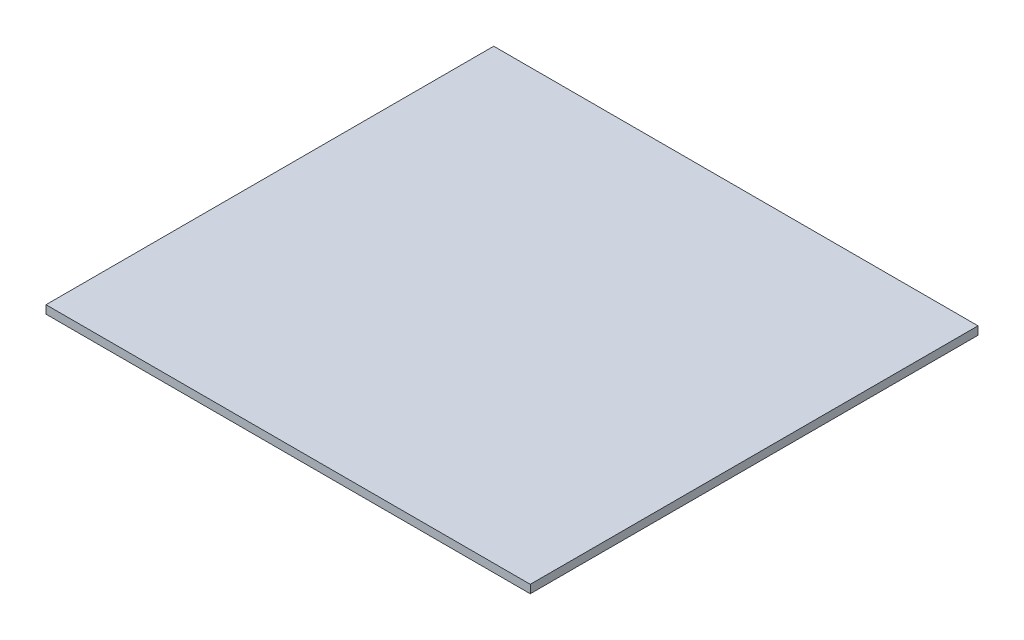
ISO-10303-21;
HEADER;
FILE_DESCRIPTION(('STEP AP214'),'2;1');
FILE_NAME('part.step','',(''),(''),'','','');
FILE_SCHEMA(('AUTOMOTIVE_DESIGN { 1 0 10303 214 1 1 1 1 }'));
ENDSEC;
DATA;
#1=APPLICATION_CONTEXT('core data for automotive mechanical design processes');
#2=APPLICATION_PROTOCOL_DEFINITION('international standard','automotive_design',2000,#1);
#3=PRODUCT_CONTEXT('',#1,'mechanical');
#4=PRODUCT('Part','Part','',(#3));
#5=PRODUCT_RELATED_PRODUCT_CATEGORY('part','',(#4));
#6=PRODUCT_DEFINITION_FORMATION('','',#4);
#7=PRODUCT_DEFINITION_CONTEXT('part definition',#1,'design');
#8=PRODUCT_DEFINITION('design','',#6,#7);
#9=PRODUCT_DEFINITION_SHAPE('','',#8);
#10=(LENGTH_UNIT() NAMED_UNIT(*) SI_UNIT(.MILLI.,.METRE.));
#11=(NAMED_UNIT(*) PLANE_ANGLE_UNIT() SI_UNIT($,.RADIAN.));
#12=(NAMED_UNIT(*) SI_UNIT($,.STERADIAN.) SOLID_ANGLE_UNIT());
#13=UNCERTAINTY_MEASURE_WITH_UNIT(LENGTH_MEASURE(1.E-05),#10,'distance_accuracy_value','');
#14=(GEOMETRIC_REPRESENTATION_CONTEXT(3) GLOBAL_UNCERTAINTY_ASSIGNED_CONTEXT((#13)) GLOBAL_UNIT_ASSIGNED_CONTEXT((#10,
#11,#12)) REPRESENTATION_CONTEXT('',''));
#15=CARTESIAN_POINT('',(0.,0.,0.));
#16=DIRECTION('',(0.,0.,1.));
#17=DIRECTION('',(1.,0.,0.));
#18=AXIS2_PLACEMENT_3D('',#15,#16,#17);
#19=CARTESIAN_POINT('',(530.,18.,490.));
#20=DIRECTION('',(-1.,0.,0.));
#21=DIRECTION('',(0.,0.,1.));
#22=AXIS2_PLACEMENT_3D('',#19,#20,#21);
#23=PLANE('',#22);
#24=DIRECTION('',(0.,0.,-1.));
#25=VECTOR('',#24,1.);
#26=CARTESIAN_POINT('',(530.,0.,490.));
#27=LINE('',#26,#25);
#28=CARTESIAN_POINT('',(530.,0.,490.));
#29=VERTEX_POINT('',#28);
#30=CARTESIAN_POINT('',(530.,0.,-490.));
#31=VERTEX_POINT('',#30);
#32=EDGE_CURVE('E102',#29,#31,#27,.T.);
#33=ORIENTED_EDGE('',*,*,#32,.T.);
#34=DIRECTION('',(0.,-1.,0.));
#35=VECTOR('',#34,1.);
#36=CARTESIAN_POINT('',(530.,18.,-490.));
#37=LINE('',#36,#35);
#38=CARTESIAN_POINT('',(530.,18.,-490.));
#39=VERTEX_POINT('',#38);
#40=EDGE_CURVE('E11',#39,#31,#37,.T.);
#41=ORIENTED_EDGE('',*,*,#40,.F.);
#42=DIRECTION('',(0.,0.,-1.));
#43=VECTOR('',#42,1.);
#44=CARTESIAN_POINT('',(530.,18.,490.));
#45=LINE('',#44,#43);
#46=CARTESIAN_POINT('',(530.,18.,490.));
#47=VERTEX_POINT('',#46);
#48=EDGE_CURVE('E90',#47,#39,#45,.T.);
#49=ORIENTED_EDGE('',*,*,#48,.F.);
#50=DIRECTION('',(0.,-1.,0.));
#51=VECTOR('',#50,1.);
#52=CARTESIAN_POINT('',(530.,18.,490.));
#53=LINE('',#52,#51);
#54=EDGE_CURVE('E98',#47,#29,#53,.T.);
#55=ORIENTED_EDGE('',*,*,#54,.T.);
#56=EDGE_LOOP('',(#33,#41,#49,#55));
#57=FACE_BOUND('',#56,.T.);
#58=ADVANCED_FACE('F39',(#57),#23,.F.);
#59=CARTESIAN_POINT('',(-530.,18.,-490.));
#60=DIRECTION('',(0.,0.,1.));
#61=DIRECTION('',(1.,0.,0.));
#62=AXIS2_PLACEMENT_3D('',#59,#60,#61);
#63=PLANE('',#62);
#64=DIRECTION('',(-1.,0.,0.));
#65=VECTOR('',#64,1.);
#66=CARTESIAN_POINT('',(-530.,0.,-490.));
#67=LINE('',#66,#65);
#68=CARTESIAN_POINT('',(-530.,0.,-490.));
#69=VERTEX_POINT('',#68);
#70=EDGE_CURVE('E94',#31,#69,#67,.T.);
#71=ORIENTED_EDGE('',*,*,#70,.T.);
#72=DIRECTION('',(0.,-1.,0.));
#73=VECTOR('',#72,1.);
#74=CARTESIAN_POINT('',(-530.,18.,-490.));
#75=LINE('',#74,#73);
#76=CARTESIAN_POINT('',(-530.,18.,-490.));
#77=VERTEX_POINT('',#76);
#78=EDGE_CURVE('E47',#77,#69,#75,.T.);
#79=ORIENTED_EDGE('',*,*,#78,.F.);
#80=DIRECTION('',(-1.,0.,0.));
#81=VECTOR('',#80,1.);
#82=CARTESIAN_POINT('',(-530.,18.,-490.));
#83=LINE('',#82,#81);
#84=EDGE_CURVE('E85',#39,#77,#83,.T.);
#85=ORIENTED_EDGE('',*,*,#84,.F.);
#86=ORIENTED_EDGE('',*,*,#40,.T.);
#87=EDGE_LOOP('',(#71,#79,#85,#86));
#88=FACE_BOUND('',#87,.T.);
#89=ADVANCED_FACE('F93',(#88),#63,.F.);
#90=CARTESIAN_POINT('',(-530.,18.,490.));
#91=DIRECTION('',(1.,0.,0.));
#92=DIRECTION('',(0.,0.,-1.));
#93=AXIS2_PLACEMENT_3D('',#90,#91,#92);
#94=PLANE('',#93);
#95=DIRECTION('',(0.,0.,1.));
#96=VECTOR('',#95,1.);
#97=CARTESIAN_POINT('',(-530.,0.,490.));
#98=LINE('',#97,#96);
#99=CARTESIAN_POINT('',(-530.,0.,490.));
#100=VERTEX_POINT('',#99);
#101=EDGE_CURVE('E72',#69,#100,#98,.T.);
#102=ORIENTED_EDGE('',*,*,#101,.T.);
#103=DIRECTION('',(0.,-1.,0.));
#104=VECTOR('',#103,1.);
#105=CARTESIAN_POINT('',(-530.,18.,490.));
#106=LINE('',#105,#104);
#107=CARTESIAN_POINT('',(-530.,18.,490.));
#108=VERTEX_POINT('',#107);
#109=EDGE_CURVE('E95',#108,#100,#106,.T.);
#110=ORIENTED_EDGE('',*,*,#109,.F.);
#111=DIRECTION('',(0.,0.,1.));
#112=VECTOR('',#111,1.);
#113=CARTESIAN_POINT('',(-530.,18.,490.));
#114=LINE('',#113,#112);
#115=EDGE_CURVE('E88',#77,#108,#114,.T.);
#116=ORIENTED_EDGE('',*,*,#115,.F.);
#117=ORIENTED_EDGE('',*,*,#78,.T.);
#118=EDGE_LOOP('',(#102,#110,#116,#117));
#119=FACE_BOUND('',#118,.T.);
#120=ADVANCED_FACE('F96',(#119),#94,.F.);
#121=CARTESIAN_POINT('',(-530.,18.,490.));
#122=DIRECTION('',(0.,0.,-1.));
#123=DIRECTION('',(-1.,0.,0.));
#124=AXIS2_PLACEMENT_3D('',#121,#122,#123);
#125=PLANE('',#124);
#126=DIRECTION('',(1.,0.,0.));
#127=VECTOR('',#126,1.);
#128=CARTESIAN_POINT('',(-530.,0.,490.));
#129=LINE('',#128,#127);
#130=EDGE_CURVE('E78',#100,#29,#129,.T.);
#131=ORIENTED_EDGE('',*,*,#130,.T.);
#132=ORIENTED_EDGE('',*,*,#54,.F.);
#133=DIRECTION('',(1.,0.,0.));
#134=VECTOR('',#133,1.);
#135=CARTESIAN_POINT('',(-530.,18.,490.));
#136=LINE('',#135,#134);
#137=EDGE_CURVE('E55',#108,#47,#136,.T.);
#138=ORIENTED_EDGE('',*,*,#137,.F.);
#139=ORIENTED_EDGE('',*,*,#109,.T.);
#140=EDGE_LOOP('',(#131,#132,#138,#139));
#141=FACE_BOUND('',#140,.T.);
#142=ADVANCED_FACE('F109',(#141),#125,.F.);
#143=CARTESIAN_POINT('',(0.,18.,0.));
#144=DIRECTION('',(0.,-1.,0.));
#145=DIRECTION('',(0.,0.,-1.));
#146=AXIS2_PLACEMENT_3D('',#143,#144,#145);
#147=PLANE('',#146);
#148=ORIENTED_EDGE('',*,*,#48,.T.);
#149=ORIENTED_EDGE('',*,*,#84,.T.);
#150=ORIENTED_EDGE('',*,*,#115,.T.);
#151=ORIENTED_EDGE('',*,*,#137,.T.);
#152=EDGE_LOOP('',(#148,#149,#150,#151));
#153=FACE_BOUND('',#152,.T.);
#154=ADVANCED_FACE('F86',(#153),#147,.F.);
#155=CARTESIAN_POINT('',(0.,0.,0.));
#156=DIRECTION('',(0.,-1.,0.));
#157=DIRECTION('',(0.,0.,-1.));
#158=AXIS2_PLACEMENT_3D('',#155,#156,#157);
#159=PLANE('',#158);
#160=ORIENTED_EDGE('',*,*,#32,.F.);
#161=ORIENTED_EDGE('',*,*,#130,.F.);
#162=ORIENTED_EDGE('',*,*,#101,.F.);
#163=ORIENTED_EDGE('',*,*,#70,.F.);
#164=EDGE_LOOP('',(#160,#161,#162,#163));
#165=FACE_BOUND('',#164,.T.);
#166=ADVANCED_FACE('F112',(#165),#159,.T.);
#167=CLOSED_SHELL('',(#58,#89,#120,#142,#154,#166));
#168=MANIFOLD_SOLID_BREP('B2',#167);
#169=ADVANCED_BREP_SHAPE_REPRESENTATION('',(#18,#168),#14);
#170=SHAPE_DEFINITION_REPRESENTATION(#9,#169);
ENDSEC;
END-ISO-10303-21;
